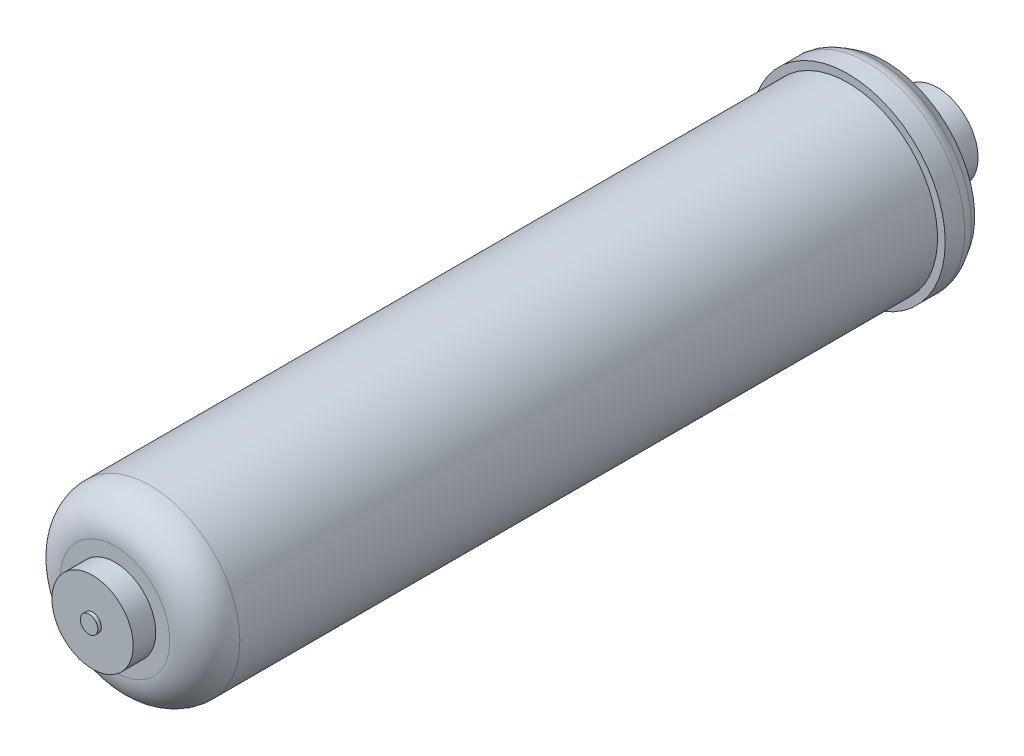
ISO-10303-21;
HEADER;
FILE_DESCRIPTION(('STEP AP214'),'2;1');
FILE_NAME('part.step','',(''),(''),'','','');
FILE_SCHEMA(('AUTOMOTIVE_DESIGN { 1 0 10303 214 1 1 1 1 }'));
ENDSEC;
DATA;
#1=APPLICATION_CONTEXT('core data for automotive mechanical design processes');
#2=APPLICATION_PROTOCOL_DEFINITION('international standard','automotive_design',2000,#1);
#3=PRODUCT_CONTEXT('',#1,'mechanical');
#4=PRODUCT('Part','Part','',(#3));
#5=PRODUCT_RELATED_PRODUCT_CATEGORY('part','',(#4));
#6=PRODUCT_DEFINITION_FORMATION('','',#4);
#7=PRODUCT_DEFINITION_CONTEXT('part definition',#1,'design');
#8=PRODUCT_DEFINITION('design','',#6,#7);
#9=PRODUCT_DEFINITION_SHAPE('','',#8);
#10=(LENGTH_UNIT() NAMED_UNIT(*) SI_UNIT(.MILLI.,.METRE.));
#11=(NAMED_UNIT(*) PLANE_ANGLE_UNIT() SI_UNIT($,.RADIAN.));
#12=(NAMED_UNIT(*) SI_UNIT($,.STERADIAN.) SOLID_ANGLE_UNIT());
#13=UNCERTAINTY_MEASURE_WITH_UNIT(LENGTH_MEASURE(1.E-05),#10,'distance_accuracy_value','');
#14=(GEOMETRIC_REPRESENTATION_CONTEXT(3) GLOBAL_UNCERTAINTY_ASSIGNED_CONTEXT((#13)) GLOBAL_UNIT_ASSIGNED_CONTEXT((#10,
#11,#12)) REPRESENTATION_CONTEXT('',''));
#15=CARTESIAN_POINT('',(0.,0.,0.));
#16=DIRECTION('',(0.,0.,1.));
#17=DIRECTION('',(1.,0.,0.));
#18=AXIS2_PLACEMENT_3D('',#15,#16,#17);
#19=CARTESIAN_POINT('',(0.,0.,0.));
#20=DIRECTION('',(0.,0.,-1.));
#21=DIRECTION('',(-1.,0.,0.));
#22=AXIS2_PLACEMENT_3D('',#19,#20,#21);
#23=PLANE('',#22);
#24=CARTESIAN_POINT('',(0.,0.,0.));
#25=DIRECTION('',(0.,0.,-1.));
#26=DIRECTION('',(-1.,0.,0.));
#27=AXIS2_PLACEMENT_3D('',#24,#25,#26);
#28=CIRCLE('',#27,3.175);
#29=CARTESIAN_POINT('',(-3.175,0.,0.));
#30=VERTEX_POINT('',#29);
#31=EDGE_CURVE('E68',#30,#30,#28,.T.);
#32=ORIENTED_EDGE('',*,*,#31,.T.);
#33=EDGE_LOOP('',(#32));
#34=FACE_BOUND('',#33,.T.);
#35=ADVANCED_FACE('F41',(#34),#23,.T.);
#36=CARTESIAN_POINT('',(0.,0.,0.));
#37=DIRECTION('',(0.,0.,-1.));
#38=DIRECTION('',(-1.,0.,0.));
#39=AXIS2_PLACEMENT_3D('',#36,#37,#38);
#40=CYLINDRICAL_SURFACE('',#39,3.175);
#41=CARTESIAN_POINT('',(0.,0.,1.27));
#42=DIRECTION('',(0.,0.,-1.));
#43=DIRECTION('',(-1.,0.,0.));
#44=AXIS2_PLACEMENT_3D('',#41,#42,#43);
#45=CIRCLE('',#44,3.175);
#46=CARTESIAN_POINT('',(-3.175,0.,1.27));
#47=VERTEX_POINT('',#46);
#48=EDGE_CURVE('E72',#47,#47,#45,.T.);
#49=ORIENTED_EDGE('',*,*,#48,.T.);
#50=EDGE_LOOP('',(#49));
#51=FACE_BOUND('',#50,.T.);
#52=ORIENTED_EDGE('',*,*,#31,.F.);
#53=EDGE_LOOP('',(#52));
#54=FACE_BOUND('',#53,.T.);
#55=ADVANCED_FACE('F124',(#51,#54),#40,.T.);
#56=CARTESIAN_POINT('',(0.,3.175,1.27));
#57=DIRECTION('',(0.,0.,-1.));
#58=DIRECTION('',(-1.,0.,0.));
#59=AXIS2_PLACEMENT_3D('',#56,#57,#58);
#60=PLANE('',#59);
#61=CARTESIAN_POINT('',(0.,0.,1.27));
#62=DIRECTION('',(0.,0.,-1.));
#63=DIRECTION('',(-1.,0.,0.));
#64=AXIS2_PLACEMENT_3D('',#61,#62,#63);
#65=CIRCLE('',#64,14.732);
#66=CARTESIAN_POINT('',(-14.732,0.,1.27));
#67=VERTEX_POINT('',#66);
#68=EDGE_CURVE('E76',#67,#67,#65,.T.);
#69=ORIENTED_EDGE('',*,*,#68,.T.);
#70=EDGE_LOOP('',(#69));
#71=FACE_BOUND('',#70,.T.);
#72=ORIENTED_EDGE('',*,*,#48,.F.);
#73=EDGE_LOOP('',(#72));
#74=FACE_BOUND('',#73,.T.);
#75=ADVANCED_FACE('F130',(#71,#74),#60,.T.);
#76=CARTESIAN_POINT('',(0.,0.,0.));
#77=DIRECTION('',(0.,0.,-1.));
#78=DIRECTION('',(-1.,0.,0.));
#79=AXIS2_PLACEMENT_3D('',#76,#77,#78);
#80=CYLINDRICAL_SURFACE('',#79,14.732);
#81=CARTESIAN_POINT('',(0.,0.,9.398));
#82=DIRECTION('',(0.,0.,-1.));
#83=DIRECTION('',(-1.,0.,0.));
#84=AXIS2_PLACEMENT_3D('',#81,#82,#83);
#85=CIRCLE('',#84,14.732);
#86=CARTESIAN_POINT('',(-14.732,0.,9.398));
#87=VERTEX_POINT('',#86);
#88=EDGE_CURVE('E80',#87,#87,#85,.T.);
#89=ORIENTED_EDGE('',*,*,#88,.T.);
#90=EDGE_LOOP('',(#89));
#91=FACE_BOUND('',#90,.T.);
#92=ORIENTED_EDGE('',*,*,#68,.F.);
#93=EDGE_LOOP('',(#92));
#94=FACE_BOUND('',#93,.T.);
#95=ADVANCED_FACE('F136',(#91,#94),#80,.T.);
#96=CARTESIAN_POINT('',(0.,0.,9.398));
#97=DIRECTION('',(0.,0.,1.));
#98=DIRECTION('',(1.,0.,0.));
#99=AXIS2_PLACEMENT_3D('',#96,#97,#98);
#100=CONICAL_SURFACE('',#99,14.732,1.02101761241669);
#101=CARTESIAN_POINT('',(0.,0.,20.32));
#102=DIRECTION('',(0.,0.,-1.));
#103=DIRECTION('',(-1.,0.,0.));
#104=AXIS2_PLACEMENT_3D('',#101,#102,#103);
#105=CIRCLE('',#104,32.5550841268207);
#106=CARTESIAN_POINT('',(-32.5550841268207,0.,20.32));
#107=VERTEX_POINT('',#106);
#108=EDGE_CURVE('E84',#107,#107,#105,.T.);
#109=ORIENTED_EDGE('',*,*,#108,.T.);
#110=EDGE_LOOP('',(#109));
#111=FACE_BOUND('',#110,.T.);
#112=ORIENTED_EDGE('',*,*,#88,.F.);
#113=EDGE_LOOP('',(#112));
#114=FACE_BOUND('',#113,.T.);
#115=ADVANCED_FACE('F140',(#111,#114),#100,.T.);
#116=CARTESIAN_POINT('',(0.,0.,20.32));
#117=DIRECTION('',(0.,0.,1.));
#118=DIRECTION('',(1.,0.,0.));
#119=AXIS2_PLACEMENT_3D('',#116,#117,#118);
#120=CONICAL_SURFACE('',#119,32.5550841268207,0.541659485455927);
#121=CARTESIAN_POINT('',(0.,0.,23.3812905502817));
#122=DIRECTION('',(0.,0.,-1.));
#123=DIRECTION('',(-1.,0.,0.));
#124=AXIS2_PLACEMENT_3D('',#121,#122,#123);
#125=CIRCLE('',#124,34.3970248020577);
#126=CARTESIAN_POINT('',(-34.3970248020577,0.,23.3812905502817));
#127=VERTEX_POINT('',#126);
#128=EDGE_CURVE('E49',#127,#127,#125,.T.);
#129=ORIENTED_EDGE('',*,*,#128,.T.);
#130=EDGE_LOOP('',(#129));
#131=FACE_BOUND('',#130,.T.);
#132=ORIENTED_EDGE('',*,*,#108,.F.);
#133=EDGE_LOOP('',(#132));
#134=FACE_BOUND('',#133,.T.);
#135=ADVANCED_FACE('F144',(#131,#134),#120,.T.);
#136=CARTESIAN_POINT('',(0.,0.,0.));
#137=DIRECTION('',(0.,0.,-1.));
#138=DIRECTION('',(-1.,0.,0.));
#139=AXIS2_PLACEMENT_3D('',#136,#137,#138);
#140=CYLINDRICAL_SURFACE('',#139,35.306);
#141=CARTESIAN_POINT('',(0.,0.,26.6550879025001));
#142=DIRECTION('',(0.,0.,1.));
#143=DIRECTION('',(1.,0.,0.));
#144=AXIS2_PLACEMENT_3D('',#141,#142,#143);
#145=CIRCLE('',#144,35.306);
#146=CARTESIAN_POINT('',(35.306,0.,26.6550879025001));
#147=VERTEX_POINT('',#146);
#148=EDGE_CURVE('E10',#147,#147,#145,.T.);
#149=ORIENTED_EDGE('',*,*,#148,.T.);
#150=EDGE_LOOP('',(#149));
#151=FACE_BOUND('',#150,.T.);
#152=CARTESIAN_POINT('',(0.,0.,33.7566));
#153=DIRECTION('',(0.,0.,-1.));
#154=DIRECTION('',(-1.,0.,0.));
#155=AXIS2_PLACEMENT_3D('',#152,#153,#154);
#156=CIRCLE('',#155,35.306);
#157=CARTESIAN_POINT('',(-35.306,0.,33.7566));
#158=VERTEX_POINT('',#157);
#159=EDGE_CURVE('E87',#158,#158,#156,.T.);
#160=ORIENTED_EDGE('',*,*,#159,.T.);
#161=EDGE_LOOP('',(#160));
#162=FACE_BOUND('',#161,.T.);
#163=ADVANCED_FACE('F148',(#151,#162),#140,.T.);
#164=CARTESIAN_POINT('',(0.,35.306,33.7566));
#165=DIRECTION('',(0.,0.,1.));
#166=DIRECTION('',(1.,0.,0.));
#167=AXIS2_PLACEMENT_3D('',#164,#165,#166);
#168=PLANE('',#167);
#169=CARTESIAN_POINT('',(0.,0.,33.7566));
#170=DIRECTION('',(0.,0.,-1.));
#171=DIRECTION('',(-1.,0.,0.));
#172=AXIS2_PLACEMENT_3D('',#169,#170,#171);
#173=CIRCLE('',#172,32.512);
#174=CARTESIAN_POINT('',(-32.512,0.,33.7566));
#175=VERTEX_POINT('',#174);
#176=EDGE_CURVE('E90',#175,#175,#173,.T.);
#177=ORIENTED_EDGE('',*,*,#176,.T.);
#178=EDGE_LOOP('',(#177));
#179=FACE_BOUND('',#178,.T.);
#180=ORIENTED_EDGE('',*,*,#159,.F.);
#181=EDGE_LOOP('',(#180));
#182=FACE_BOUND('',#181,.T.);
#183=ADVANCED_FACE('F151',(#179,#182),#168,.T.);
#184=CARTESIAN_POINT('',(0.,0.,0.));
#185=DIRECTION('',(0.,0.,-1.));
#186=DIRECTION('',(-1.,0.,0.));
#187=AXIS2_PLACEMENT_3D('',#184,#185,#186);
#188=CYLINDRICAL_SURFACE('',#187,32.512);
#189=CARTESIAN_POINT('',(0.,0.,286.7152));
#190=DIRECTION('',(0.,0.,1.));
#191=DIRECTION('',(1.,0.,0.));
#192=AXIS2_PLACEMENT_3D('',#189,#190,#191);
#193=CIRCLE('',#192,32.512);
#194=CARTESIAN_POINT('',(32.512,0.,286.7152));
#195=VERTEX_POINT('',#194);
#196=EDGE_CURVE('E62',#195,#195,#193,.F.);
#197=ORIENTED_EDGE('',*,*,#196,.T.);
#198=EDGE_LOOP('',(#197));
#199=FACE_BOUND('',#198,.T.);
#200=ORIENTED_EDGE('',*,*,#176,.F.);
#201=EDGE_LOOP('',(#200));
#202=FACE_BOUND('',#201,.T.);
#203=ADVANCED_FACE('F154',(#199,#202),#188,.T.);
#204=CARTESIAN_POINT('',(0.,32.512,299.4152));
#205=DIRECTION('',(0.,0.,1.));
#206=DIRECTION('',(1.,0.,0.));
#207=AXIS2_PLACEMENT_3D('',#204,#205,#206);
#208=PLANE('',#207);
#209=CARTESIAN_POINT('',(0.,0.,299.4152));
#210=DIRECTION('',(0.,0.,1.));
#211=DIRECTION('',(1.,0.,0.));
#212=AXIS2_PLACEMENT_3D('',#209,#210,#211);
#213=CIRCLE('',#212,19.812);
#214=CARTESIAN_POINT('',(19.812,0.,299.4152));
#215=VERTEX_POINT('',#214);
#216=EDGE_CURVE('E56',#215,#215,#213,.T.);
#217=ORIENTED_EDGE('',*,*,#216,.T.);
#218=EDGE_LOOP('',(#217));
#219=FACE_BOUND('',#218,.T.);
#220=CARTESIAN_POINT('',(0.,0.,299.4152));
#221=DIRECTION('',(0.,0.,-1.));
#222=DIRECTION('',(-1.,0.,0.));
#223=AXIS2_PLACEMENT_3D('',#220,#221,#222);
#224=CIRCLE('',#223,14.732);
#225=CARTESIAN_POINT('',(-14.732,0.,299.4152));
#226=VERTEX_POINT('',#225);
#227=EDGE_CURVE('E93',#226,#226,#224,.T.);
#228=ORIENTED_EDGE('',*,*,#227,.T.);
#229=EDGE_LOOP('',(#228));
#230=FACE_BOUND('',#229,.T.);
#231=ADVANCED_FACE('F158',(#219,#230),#208,.T.);
#232=CARTESIAN_POINT('',(0.,0.,0.));
#233=DIRECTION('',(0.,0.,-1.));
#234=DIRECTION('',(-1.,0.,0.));
#235=AXIS2_PLACEMENT_3D('',#232,#233,#234);
#236=CYLINDRICAL_SURFACE('',#235,14.732);
#237=CARTESIAN_POINT('',(0.,0.,307.594));
#238=DIRECTION('',(0.,0.,-1.));
#239=DIRECTION('',(-1.,0.,0.));
#240=AXIS2_PLACEMENT_3D('',#237,#238,#239);
#241=CIRCLE('',#240,14.732);
#242=CARTESIAN_POINT('',(-14.732,0.,307.594));
#243=VERTEX_POINT('',#242);
#244=EDGE_CURVE('E97',#243,#243,#241,.T.);
#245=ORIENTED_EDGE('',*,*,#244,.T.);
#246=EDGE_LOOP('',(#245));
#247=FACE_BOUND('',#246,.T.);
#248=ORIENTED_EDGE('',*,*,#227,.F.);
#249=EDGE_LOOP('',(#248));
#250=FACE_BOUND('',#249,.T.);
#251=ADVANCED_FACE('F162',(#247,#250),#236,.T.);
#252=CARTESIAN_POINT('',(0.,14.732,307.594));
#253=DIRECTION('',(0.,0.,1.));
#254=DIRECTION('',(1.,0.,0.));
#255=AXIS2_PLACEMENT_3D('',#252,#253,#254);
#256=PLANE('',#255);
#257=CARTESIAN_POINT('',(0.,0.,307.594));
#258=DIRECTION('',(0.,0.,-1.));
#259=DIRECTION('',(-1.,0.,0.));
#260=AXIS2_PLACEMENT_3D('',#257,#258,#259);
#261=CIRCLE('',#260,3.17499999999996);
#262=CARTESIAN_POINT('',(-3.17499999999996,0.,307.594));
#263=VERTEX_POINT('',#262);
#264=EDGE_CURVE('E101',#263,#263,#261,.T.);
#265=ORIENTED_EDGE('',*,*,#264,.T.);
#266=EDGE_LOOP('',(#265));
#267=FACE_BOUND('',#266,.T.);
#268=ORIENTED_EDGE('',*,*,#244,.F.);
#269=EDGE_LOOP('',(#268));
#270=FACE_BOUND('',#269,.T.);
#271=ADVANCED_FACE('F121',(#267,#270),#256,.T.);
#272=CARTESIAN_POINT('',(0.,0.,0.));
#273=DIRECTION('',(0.,0.,-1.));
#274=DIRECTION('',(-1.,0.,0.));
#275=AXIS2_PLACEMENT_3D('',#272,#273,#274);
#276=CYLINDRICAL_SURFACE('',#275,3.17499999999996);
#277=CARTESIAN_POINT('',(0.,0.,308.864));
#278=DIRECTION('',(0.,0.,-1.));
#279=DIRECTION('',(-1.,0.,0.));
#280=AXIS2_PLACEMENT_3D('',#277,#278,#279);
#281=CIRCLE('',#280,3.17499999999996);
#282=CARTESIAN_POINT('',(-3.17499999999996,0.,308.864));
#283=VERTEX_POINT('',#282);
#284=EDGE_CURVE('E105',#283,#283,#281,.T.);
#285=ORIENTED_EDGE('',*,*,#284,.T.);
#286=EDGE_LOOP('',(#285));
#287=FACE_BOUND('',#286,.T.);
#288=ORIENTED_EDGE('',*,*,#264,.F.);
#289=EDGE_LOOP('',(#288));
#290=FACE_BOUND('',#289,.T.);
#291=ADVANCED_FACE('F109',(#287,#290),#276,.T.);
#292=CARTESIAN_POINT('',(0.,3.17499999999996,308.864));
#293=DIRECTION('',(0.,0.,1.));
#294=DIRECTION('',(1.,0.,0.));
#295=AXIS2_PLACEMENT_3D('',#292,#293,#294);
#296=PLANE('',#295);
#297=ORIENTED_EDGE('',*,*,#284,.F.);
#298=EDGE_LOOP('',(#297));
#299=FACE_BOUND('',#298,.T.);
#300=ADVANCED_FACE('F112',(#299),#296,.T.);
#301=CARTESIAN_POINT('',(0.,0.,286.7152));
#302=DIRECTION('',(0.,0.,1.));
#303=DIRECTION('',(1.,0.,0.));
#304=AXIS2_PLACEMENT_3D('',#301,#302,#303);
#305=TOROIDAL_SURFACE('',#304,19.812,12.7);
#306=ORIENTED_EDGE('',*,*,#216,.F.);
#307=EDGE_LOOP('',(#306));
#308=FACE_BOUND('',#307,.T.);
#309=ORIENTED_EDGE('',*,*,#196,.F.);
#310=EDGE_LOOP('',(#309));
#311=FACE_BOUND('',#310,.T.);
#312=ADVANCED_FACE('F114',(#308,#311),#305,.T.);
#313=CARTESIAN_POINT('',(0.,0.,26.6550879025001));
#314=DIRECTION('',(0.,0.,1.));
#315=DIRECTION('',(1.,0.,0.));
#316=AXIS2_PLACEMENT_3D('',#313,#314,#315);
#317=TOROIDAL_SURFACE('',#316,28.956,6.35);
#318=ORIENTED_EDGE('',*,*,#148,.F.);
#319=EDGE_LOOP('',(#318));
#320=FACE_BOUND('',#319,.T.);
#321=ORIENTED_EDGE('',*,*,#128,.F.);
#322=EDGE_LOOP('',(#321));
#323=FACE_BOUND('',#322,.T.);
#324=ADVANCED_FACE('F43',(#320,#323),#317,.T.);
#325=CLOSED_SHELL('',(#35,#55,#75,#95,#115,#135,#163,#183,#203,#231,#251,#271,#291,#300,#312,#324));
#326=MANIFOLD_SOLID_BREP('B2',#325);
#327=ADVANCED_BREP_SHAPE_REPRESENTATION('',(#18,#326),#14);
#328=SHAPE_DEFINITION_REPRESENTATION(#9,#327);
ENDSEC;
END-ISO-10303-21;
